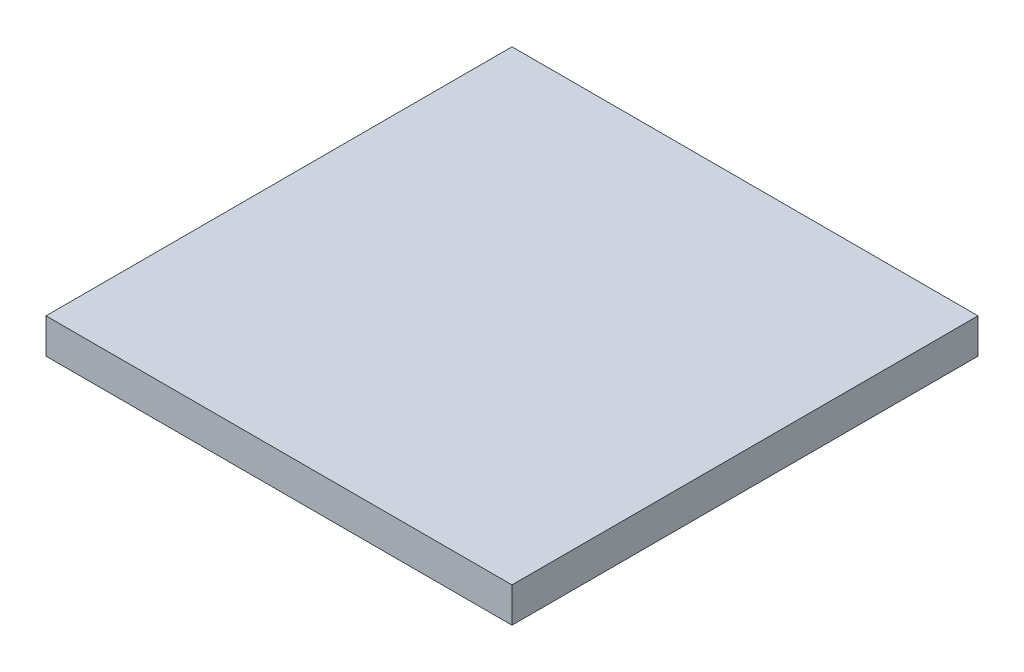
ISO-10303-21;
HEADER;
FILE_DESCRIPTION(('STEP AP214'),'2;1');
FILE_NAME('part.step','',(''),(''),'','','');
FILE_SCHEMA(('AUTOMOTIVE_DESIGN { 1 0 10303 214 1 1 1 1 }'));
ENDSEC;
DATA;
#1=APPLICATION_CONTEXT('core data for automotive mechanical design processes');
#2=APPLICATION_PROTOCOL_DEFINITION('international standard','automotive_design',2000,#1);
#3=PRODUCT_CONTEXT('',#1,'mechanical');
#4=PRODUCT('Part','Part','',(#3));
#5=PRODUCT_RELATED_PRODUCT_CATEGORY('part','',(#4));
#6=PRODUCT_DEFINITION_FORMATION('','',#4);
#7=PRODUCT_DEFINITION_CONTEXT('part definition',#1,'design');
#8=PRODUCT_DEFINITION('design','',#6,#7);
#9=PRODUCT_DEFINITION_SHAPE('','',#8);
#10=(LENGTH_UNIT() NAMED_UNIT(*) SI_UNIT(.MILLI.,.METRE.));
#11=(NAMED_UNIT(*) PLANE_ANGLE_UNIT() SI_UNIT($,.RADIAN.));
#12=(NAMED_UNIT(*) SI_UNIT($,.STERADIAN.) SOLID_ANGLE_UNIT());
#13=UNCERTAINTY_MEASURE_WITH_UNIT(LENGTH_MEASURE(1.E-05),#10,'distance_accuracy_value','');
#14=(GEOMETRIC_REPRESENTATION_CONTEXT(3) GLOBAL_UNCERTAINTY_ASSIGNED_CONTEXT((#13)) GLOBAL_UNIT_ASSIGNED_CONTEXT((#10,
#11,#12)) REPRESENTATION_CONTEXT('',''));
#15=CARTESIAN_POINT('',(0.,0.,0.));
#16=DIRECTION('',(0.,0.,1.));
#17=DIRECTION('',(1.,0.,0.));
#18=AXIS2_PLACEMENT_3D('',#15,#16,#17);
#19=CARTESIAN_POINT('',(0.,2.,0.));
#20=DIRECTION('',(0.,-1.,0.));
#21=DIRECTION('',(0.,0.,-1.));
#22=AXIS2_PLACEMENT_3D('',#19,#20,#21);
#23=CYLINDRICAL_SURFACE('',#22,8.);
#24=CARTESIAN_POINT('',(0.,2.,0.));
#25=DIRECTION('',(0.,1.,0.));
#26=DIRECTION('',(0.,0.,1.));
#27=AXIS2_PLACEMENT_3D('',#24,#25,#26);
#28=CIRCLE('',#27,8.);
#29=CARTESIAN_POINT('',(0.,2.,8.));
#30=VERTEX_POINT('',#29);
#31=EDGE_CURVE('E44',#30,#30,#28,.T.);
#32=ORIENTED_EDGE('',*,*,#31,.F.);
#33=EDGE_LOOP('',(#32));
#34=FACE_BOUND('',#33,.T.);
#35=CARTESIAN_POINT('',(0.,0.,0.));
#36=DIRECTION('',(0.,1.,0.));
#37=DIRECTION('',(0.,0.,1.));
#38=AXIS2_PLACEMENT_3D('',#35,#36,#37);
#39=CIRCLE('',#38,8.);
#40=CARTESIAN_POINT('',(0.,0.,8.));
#41=VERTEX_POINT('',#40);
#42=EDGE_CURVE('E38',#41,#41,#39,.T.);
#43=ORIENTED_EDGE('',*,*,#42,.T.);
#44=EDGE_LOOP('',(#43));
#45=FACE_BOUND('',#44,.T.);
#46=ADVANCED_FACE('F35',(#34,#45),#23,.T.);
#47=CARTESIAN_POINT('',(0.,2.,0.));
#48=DIRECTION('',(0.,1.,0.));
#49=DIRECTION('',(0.,0.,1.));
#50=AXIS2_PLACEMENT_3D('',#47,#48,#49);
#51=PLANE('',#50);
#52=CARTESIAN_POINT('',(0.,2.,0.));
#53=DIRECTION('',(0.,1.,0.));
#54=DIRECTION('',(0.,0.,1.));
#55=AXIS2_PLACEMENT_3D('',#52,#53,#54);
#56=CIRCLE('',#55,2.);
#57=CARTESIAN_POINT('',(0.,2.,2.));
#58=VERTEX_POINT('',#57);
#59=EDGE_CURVE('E11',#58,#58,#56,.T.);
#60=ORIENTED_EDGE('',*,*,#59,.F.);
#61=EDGE_LOOP('',(#60));
#62=FACE_BOUND('',#61,.T.);
#63=ORIENTED_EDGE('',*,*,#31,.T.);
#64=EDGE_LOOP('',(#63));
#65=FACE_BOUND('',#64,.T.);
#66=ADVANCED_FACE('F125',(#62,#65),#51,.T.);
#67=CARTESIAN_POINT('',(0.,0.,0.));
#68=DIRECTION('',(0.,1.,0.));
#69=DIRECTION('',(0.,0.,1.));
#70=AXIS2_PLACEMENT_3D('',#67,#68,#69);
#71=PLANE('',#70);
#72=ORIENTED_EDGE('',*,*,#42,.F.);
#73=EDGE_LOOP('',(#72));
#74=FACE_BOUND('',#73,.T.);
#75=ADVANCED_FACE('F122',(#74),#71,.F.);
#76=CARTESIAN_POINT('',(0.,7.,0.));
#77=DIRECTION('',(0.,-1.,0.));
#78=DIRECTION('',(0.,0.,-1.));
#79=AXIS2_PLACEMENT_3D('',#76,#77,#78);
#80=CYLINDRICAL_SURFACE('',#79,2.);
#81=CARTESIAN_POINT('',(0.,7.,0.));
#82=DIRECTION('',(0.,1.,0.));
#83=DIRECTION('',(0.,0.,1.));
#84=AXIS2_PLACEMENT_3D('',#81,#82,#83);
#85=CIRCLE('',#84,2.);
#86=CARTESIAN_POINT('',(0.,7.,2.));
#87=VERTEX_POINT('',#86);
#88=EDGE_CURVE('E113',#87,#87,#85,.T.);
#89=ORIENTED_EDGE('',*,*,#88,.F.);
#90=EDGE_LOOP('',(#89));
#91=FACE_BOUND('',#90,.T.);
#92=ORIENTED_EDGE('',*,*,#59,.T.);
#93=EDGE_LOOP('',(#92));
#94=FACE_BOUND('',#93,.T.);
#95=ADVANCED_FACE('F124',(#91,#94),#80,.T.);
#96=CARTESIAN_POINT('',(20.,10.,-20.));
#97=DIRECTION('',(-1.,0.,0.));
#98=DIRECTION('',(0.,0.,1.));
#99=AXIS2_PLACEMENT_3D('',#96,#97,#98);
#100=PLANE('',#99);
#101=DIRECTION('',(0.,0.,-1.));
#102=VECTOR('',#101,1.);
#103=CARTESIAN_POINT('',(20.,7.,-20.));
#104=LINE('',#103,#102);
#105=CARTESIAN_POINT('',(20.,7.,20.));
#106=VERTEX_POINT('',#105);
#107=CARTESIAN_POINT('',(20.,7.,-20.));
#108=VERTEX_POINT('',#107);
#109=EDGE_CURVE('E104',#106,#108,#104,.T.);
#110=ORIENTED_EDGE('',*,*,#109,.T.);
#111=DIRECTION('',(0.,-1.,0.));
#112=VECTOR('',#111,1.);
#113=CARTESIAN_POINT('',(20.,10.,-20.));
#114=LINE('',#113,#112);
#115=CARTESIAN_POINT('',(20.,10.,-20.));
#116=VERTEX_POINT('',#115);
#117=EDGE_CURVE('E95',#116,#108,#114,.T.);
#118=ORIENTED_EDGE('',*,*,#117,.F.);
#119=DIRECTION('',(0.,0.,-1.));
#120=VECTOR('',#119,1.);
#121=CARTESIAN_POINT('',(20.,10.,-20.));
#122=LINE('',#121,#120);
#123=CARTESIAN_POINT('',(20.,10.,20.));
#124=VERTEX_POINT('',#123);
#125=EDGE_CURVE('E89',#124,#116,#122,.T.);
#126=ORIENTED_EDGE('',*,*,#125,.F.);
#127=DIRECTION('',(0.,-1.,0.));
#128=VECTOR('',#127,1.);
#129=CARTESIAN_POINT('',(20.,10.,20.));
#130=LINE('',#129,#128);
#131=EDGE_CURVE('E100',#124,#106,#130,.T.);
#132=ORIENTED_EDGE('',*,*,#131,.T.);
#133=EDGE_LOOP('',(#110,#118,#126,#132));
#134=FACE_BOUND('',#133,.T.);
#135=ADVANCED_FACE('F130',(#134),#100,.F.);
#136=CARTESIAN_POINT('',(-20.,10.,-20.));
#137=DIRECTION('',(0.,0.,1.));
#138=DIRECTION('',(1.,0.,0.));
#139=AXIS2_PLACEMENT_3D('',#136,#137,#138);
#140=PLANE('',#139);
#141=DIRECTION('',(-1.,0.,0.));
#142=VECTOR('',#141,1.);
#143=CARTESIAN_POINT('',(-20.,7.,-20.));
#144=LINE('',#143,#142);
#145=CARTESIAN_POINT('',(-20.,7.,-20.));
#146=VERTEX_POINT('',#145);
#147=EDGE_CURVE('E94',#108,#146,#144,.T.);
#148=ORIENTED_EDGE('',*,*,#147,.T.);
#149=DIRECTION('',(0.,-1.,0.));
#150=VECTOR('',#149,1.);
#151=CARTESIAN_POINT('',(-20.,10.,-20.));
#152=LINE('',#151,#150);
#153=CARTESIAN_POINT('',(-20.,10.,-20.));
#154=VERTEX_POINT('',#153);
#155=EDGE_CURVE('E92',#154,#146,#152,.T.);
#156=ORIENTED_EDGE('',*,*,#155,.F.);
#157=DIRECTION('',(-1.,0.,0.));
#158=VECTOR('',#157,1.);
#159=CARTESIAN_POINT('',(-20.,10.,-20.));
#160=LINE('',#159,#158);
#161=EDGE_CURVE('E84',#116,#154,#160,.T.);
#162=ORIENTED_EDGE('',*,*,#161,.F.);
#163=ORIENTED_EDGE('',*,*,#117,.T.);
#164=EDGE_LOOP('',(#148,#156,#162,#163));
#165=FACE_BOUND('',#164,.T.);
#166=ADVANCED_FACE('F93',(#165),#140,.F.);
#167=CARTESIAN_POINT('',(-20.,10.,-20.));
#168=DIRECTION('',(1.,0.,0.));
#169=DIRECTION('',(0.,0.,-1.));
#170=AXIS2_PLACEMENT_3D('',#167,#168,#169);
#171=PLANE('',#170);
#172=DIRECTION('',(0.,0.,1.));
#173=VECTOR('',#172,1.);
#174=CARTESIAN_POINT('',(-20.,7.,-20.));
#175=LINE('',#174,#173);
#176=CARTESIAN_POINT('',(-20.,7.,20.));
#177=VERTEX_POINT('',#176);
#178=EDGE_CURVE('E70',#146,#177,#175,.T.);
#179=ORIENTED_EDGE('',*,*,#178,.T.);
#180=DIRECTION('',(0.,-1.,0.));
#181=VECTOR('',#180,1.);
#182=CARTESIAN_POINT('',(-20.,10.,20.));
#183=LINE('',#182,#181);
#184=CARTESIAN_POINT('',(-20.,10.,20.));
#185=VERTEX_POINT('',#184);
#186=EDGE_CURVE('E96',#185,#177,#183,.T.);
#187=ORIENTED_EDGE('',*,*,#186,.F.);
#188=DIRECTION('',(0.,0.,1.));
#189=VECTOR('',#188,1.);
#190=CARTESIAN_POINT('',(-20.,10.,-20.));
#191=LINE('',#190,#189);
#192=EDGE_CURVE('E87',#154,#185,#191,.T.);
#193=ORIENTED_EDGE('',*,*,#192,.F.);
#194=ORIENTED_EDGE('',*,*,#155,.T.);
#195=EDGE_LOOP('',(#179,#187,#193,#194));
#196=FACE_BOUND('',#195,.T.);
#197=ADVANCED_FACE('F98',(#196),#171,.F.);
#198=CARTESIAN_POINT('',(-20.,10.,20.));
#199=DIRECTION('',(0.,0.,-1.));
#200=DIRECTION('',(-1.,0.,0.));
#201=AXIS2_PLACEMENT_3D('',#198,#199,#200);
#202=PLANE('',#201);
#203=DIRECTION('',(1.,0.,0.));
#204=VECTOR('',#203,1.);
#205=CARTESIAN_POINT('',(-20.,7.,20.));
#206=LINE('',#205,#204);
#207=EDGE_CURVE('E76',#177,#106,#206,.T.);
#208=ORIENTED_EDGE('',*,*,#207,.T.);
#209=ORIENTED_EDGE('',*,*,#131,.F.);
#210=DIRECTION('',(1.,0.,0.));
#211=VECTOR('',#210,1.);
#212=CARTESIAN_POINT('',(-20.,10.,20.));
#213=LINE('',#212,#211);
#214=EDGE_CURVE('E53',#185,#124,#213,.T.);
#215=ORIENTED_EDGE('',*,*,#214,.F.);
#216=ORIENTED_EDGE('',*,*,#186,.T.);
#217=EDGE_LOOP('',(#208,#209,#215,#216));
#218=FACE_BOUND('',#217,.T.);
#219=ADVANCED_FACE('F177',(#218),#202,.F.);
#220=CARTESIAN_POINT('',(0.,10.,0.));
#221=DIRECTION('',(0.,1.,0.));
#222=DIRECTION('',(0.,0.,1.));
#223=AXIS2_PLACEMENT_3D('',#220,#221,#222);
#224=PLANE('',#223);
#225=ORIENTED_EDGE('',*,*,#125,.T.);
#226=ORIENTED_EDGE('',*,*,#161,.T.);
#227=ORIENTED_EDGE('',*,*,#192,.T.);
#228=ORIENTED_EDGE('',*,*,#214,.T.);
#229=EDGE_LOOP('',(#225,#226,#227,#228));
#230=FACE_BOUND('',#229,.T.);
#231=ADVANCED_FACE('F85',(#230),#224,.T.);
#232=CARTESIAN_POINT('',(0.,7.,0.));
#233=DIRECTION('',(0.,1.,0.));
#234=DIRECTION('',(0.,0.,1.));
#235=AXIS2_PLACEMENT_3D('',#232,#233,#234);
#236=PLANE('',#235);
#237=ORIENTED_EDGE('',*,*,#88,.T.);
#238=EDGE_LOOP('',(#237));
#239=FACE_BOUND('',#238,.T.);
#240=ORIENTED_EDGE('',*,*,#109,.F.);
#241=ORIENTED_EDGE('',*,*,#207,.F.);
#242=ORIENTED_EDGE('',*,*,#178,.F.);
#243=ORIENTED_EDGE('',*,*,#147,.F.);
#244=EDGE_LOOP('',(#240,#241,#242,#243));
#245=FACE_BOUND('',#244,.T.);
#246=ADVANCED_FACE('F194',(#239,#245),#236,.F.);
#247=CLOSED_SHELL('',(#46,#66,#75,#95,#135,#166,#197,#219,#231,#246));
#248=MANIFOLD_SOLID_BREP('B2',#247);
#249=ADVANCED_BREP_SHAPE_REPRESENTATION('',(#18,#248),#14);
#250=SHAPE_DEFINITION_REPRESENTATION(#9,#249);
ENDSEC;
END-ISO-10303-21;
